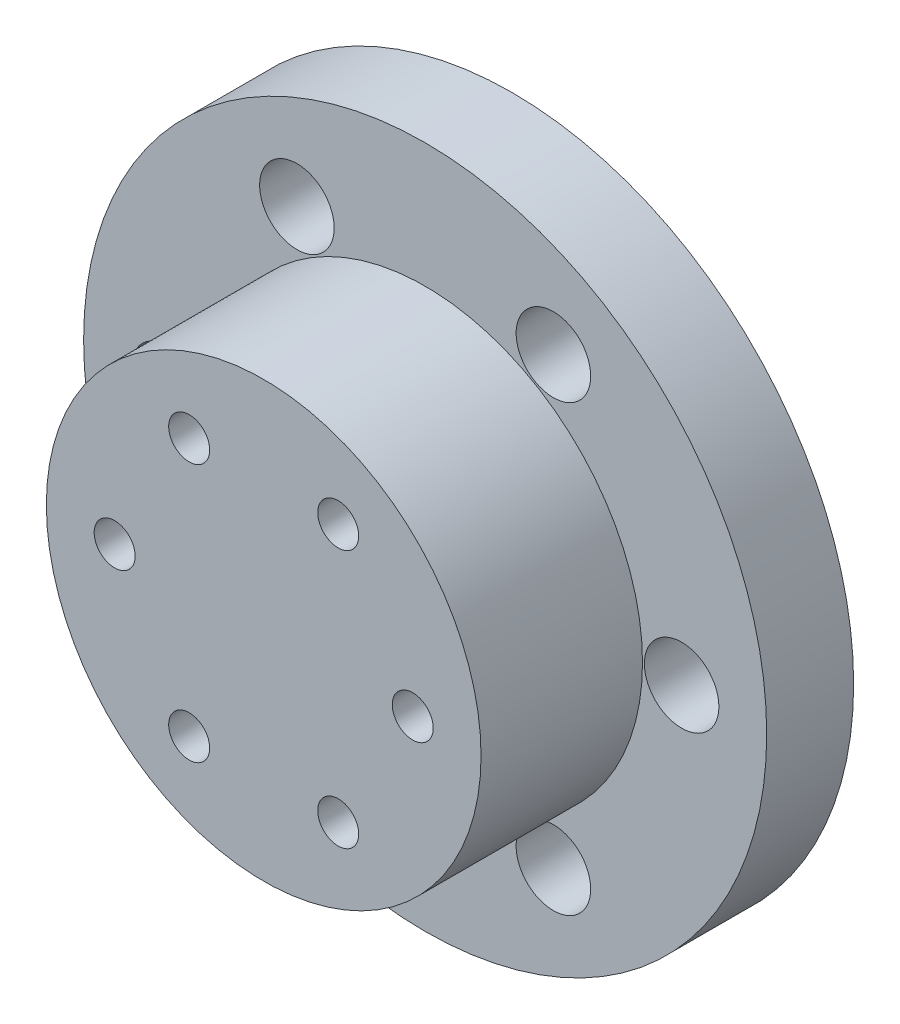
ISO-10303-21;
HEADER;
FILE_DESCRIPTION(('STEP AP214'),'2;1');
FILE_NAME('part.step','',(''),(''),'','','');
FILE_SCHEMA(('AUTOMOTIVE_DESIGN { 1 0 10303 214 1 1 1 1 }'));
ENDSEC;
DATA;
#1=APPLICATION_CONTEXT('core data for automotive mechanical design processes');
#2=APPLICATION_PROTOCOL_DEFINITION('international standard','automotive_design',2000,#1);
#3=PRODUCT_CONTEXT('',#1,'mechanical');
#4=PRODUCT('Part','Part','',(#3));
#5=PRODUCT_RELATED_PRODUCT_CATEGORY('part','',(#4));
#6=PRODUCT_DEFINITION_FORMATION('','',#4);
#7=PRODUCT_DEFINITION_CONTEXT('part definition',#1,'design');
#8=PRODUCT_DEFINITION('design','',#6,#7);
#9=PRODUCT_DEFINITION_SHAPE('','',#8);
#10=(LENGTH_UNIT() NAMED_UNIT(*) SI_UNIT(.MILLI.,.METRE.));
#11=(NAMED_UNIT(*) PLANE_ANGLE_UNIT() SI_UNIT($,.RADIAN.));
#12=(NAMED_UNIT(*) SI_UNIT($,.STERADIAN.) SOLID_ANGLE_UNIT());
#13=UNCERTAINTY_MEASURE_WITH_UNIT(LENGTH_MEASURE(1.E-05),#10,'distance_accuracy_value','');
#14=(GEOMETRIC_REPRESENTATION_CONTEXT(3) GLOBAL_UNCERTAINTY_ASSIGNED_CONTEXT((#13)) GLOBAL_UNIT_ASSIGNED_CONTEXT((#10,
#11,#12)) REPRESENTATION_CONTEXT('',''));
#15=CARTESIAN_POINT('',(0.,0.,0.));
#16=DIRECTION('',(0.,0.,1.));
#17=DIRECTION('',(1.,0.,0.));
#18=AXIS2_PLACEMENT_3D('',#15,#16,#17);
#19=CARTESIAN_POINT('',(0.,0.,7.));
#20=DIRECTION('',(0.,0.,1.));
#21=DIRECTION('',(1.,0.,0.));
#22=AXIS2_PLACEMENT_3D('',#19,#20,#21);
#23=PLANE('',#22);
#24=CARTESIAN_POINT('',(0.,0.,7.));
#25=DIRECTION('',(0.,0.,1.));
#26=DIRECTION('',(1.,0.,0.));
#27=AXIS2_PLACEMENT_3D('',#24,#25,#26);
#28=CIRCLE('',#27,17.5);
#29=CARTESIAN_POINT('',(-17.5,0.,7.));
#30=VERTEX_POINT('',#29);
#31=EDGE_CURVE('E112',#30,#30,#28,.T.);
#32=ORIENTED_EDGE('',*,*,#31,.F.);
#33=EDGE_LOOP('',(#32));
#34=FACE_BOUND('',#33,.T.);
#35=CARTESIAN_POINT('',(-10.325,17.8834245881487,7.));
#36=DIRECTION('',(0.,0.,1.));
#37=DIRECTION('',(1.,0.,0.));
#38=AXIS2_PLACEMENT_3D('',#35,#36,#37);
#39=CIRCLE('',#38,3.);
#40=CARTESIAN_POINT('',(-7.32500000000001,17.8834245881487,7.));
#41=VERTEX_POINT('',#40);
#42=EDGE_CURVE('E133',#41,#41,#39,.T.);
#43=ORIENTED_EDGE('',*,*,#42,.F.);
#44=EDGE_LOOP('',(#43));
#45=FACE_BOUND('',#44,.T.);
#46=CARTESIAN_POINT('',(-10.325,-17.8834245881487,7.));
#47=DIRECTION('',(0.,0.,1.));
#48=DIRECTION('',(1.,0.,0.));
#49=AXIS2_PLACEMENT_3D('',#46,#47,#48);
#50=CIRCLE('',#49,3.);
#51=CARTESIAN_POINT('',(-7.325,-17.8834245881487,7.));
#52=VERTEX_POINT('',#51);
#53=EDGE_CURVE('E145',#52,#52,#50,.T.);
#54=ORIENTED_EDGE('',*,*,#53,.F.);
#55=EDGE_LOOP('',(#54));
#56=FACE_BOUND('',#55,.T.);
#57=CARTESIAN_POINT('',(20.65,0.,7.));
#58=DIRECTION('',(0.,0.,1.));
#59=DIRECTION('',(1.,0.,0.));
#60=AXIS2_PLACEMENT_3D('',#57,#58,#59);
#61=CIRCLE('',#60,3.);
#62=CARTESIAN_POINT('',(23.65,0.,7.));
#63=VERTEX_POINT('',#62);
#64=EDGE_CURVE('E157',#63,#63,#61,.T.);
#65=ORIENTED_EDGE('',*,*,#64,.F.);
#66=EDGE_LOOP('',(#65));
#67=FACE_BOUND('',#66,.T.);
#68=CARTESIAN_POINT('',(0.,0.,7.));
#69=DIRECTION('',(0.,0.,1.));
#70=DIRECTION('',(1.,0.,0.));
#71=AXIS2_PLACEMENT_3D('',#68,#69,#70);
#72=CIRCLE('',#71,27.5);
#73=CARTESIAN_POINT('',(27.5,0.,7.));
#74=VERTEX_POINT('',#73);
#75=EDGE_CURVE('E11',#74,#74,#72,.T.);
#76=ORIENTED_EDGE('',*,*,#75,.T.);
#77=EDGE_LOOP('',(#76));
#78=FACE_BOUND('',#77,.T.);
#79=CARTESIAN_POINT('',(10.325,-17.8834245881487,7.));
#80=DIRECTION('',(0.,0.,1.));
#81=DIRECTION('',(1.,0.,0.));
#82=AXIS2_PLACEMENT_3D('',#79,#80,#81);
#83=CIRCLE('',#82,3.);
#84=CARTESIAN_POINT('',(13.325,-17.8834245881487,7.));
#85=VERTEX_POINT('',#84);
#86=EDGE_CURVE('E151',#85,#85,#83,.T.);
#87=ORIENTED_EDGE('',*,*,#86,.F.);
#88=EDGE_LOOP('',(#87));
#89=FACE_BOUND('',#88,.T.);
#90=CARTESIAN_POINT('',(-20.65,0.,7.));
#91=DIRECTION('',(0.,0.,1.));
#92=DIRECTION('',(1.,0.,0.));
#93=AXIS2_PLACEMENT_3D('',#90,#91,#92);
#94=CIRCLE('',#93,3.);
#95=CARTESIAN_POINT('',(-17.65,0.,7.));
#96=VERTEX_POINT('',#95);
#97=EDGE_CURVE('E139',#96,#96,#94,.T.);
#98=ORIENTED_EDGE('',*,*,#97,.F.);
#99=EDGE_LOOP('',(#98));
#100=FACE_BOUND('',#99,.T.);
#101=CARTESIAN_POINT('',(10.325,17.8834245881487,7.));
#102=DIRECTION('',(0.,0.,1.));
#103=DIRECTION('',(1.,0.,0.));
#104=AXIS2_PLACEMENT_3D('',#101,#102,#103);
#105=CIRCLE('',#104,3.);
#106=CARTESIAN_POINT('',(13.325,17.8834245881487,7.));
#107=VERTEX_POINT('',#106);
#108=EDGE_CURVE('E127',#107,#107,#105,.T.);
#109=ORIENTED_EDGE('',*,*,#108,.F.);
#110=EDGE_LOOP('',(#109));
#111=FACE_BOUND('',#110,.T.);
#112=ADVANCED_FACE('F36',(#34,#45,#56,#67,#78,#89,#100,#111),#23,.T.);
#113=CARTESIAN_POINT('',(0.,0.,0.));
#114=DIRECTION('',(0.,0.,1.));
#115=DIRECTION('',(1.,0.,0.));
#116=AXIS2_PLACEMENT_3D('',#113,#114,#115);
#117=PLANE('',#116);
#118=CARTESIAN_POINT('',(0.,0.,0.));
#119=DIRECTION('',(0.,0.,-1.));
#120=DIRECTION('',(-1.,0.,0.));
#121=AXIS2_PLACEMENT_3D('',#118,#119,#120);
#122=CIRCLE('',#121,10.5);
#123=CARTESIAN_POINT('',(-10.5,0.,0.));
#124=VERTEX_POINT('',#123);
#125=EDGE_CURVE('E118',#124,#124,#122,.T.);
#126=ORIENTED_EDGE('',*,*,#125,.F.);
#127=EDGE_LOOP('',(#126));
#128=FACE_BOUND('',#127,.T.);
#129=CARTESIAN_POINT('',(0.,0.,0.));
#130=DIRECTION('',(0.,0.,1.));
#131=DIRECTION('',(1.,0.,0.));
#132=AXIS2_PLACEMENT_3D('',#129,#130,#131);
#133=CIRCLE('',#132,27.5);
#134=CARTESIAN_POINT('',(27.5,0.,0.));
#135=VERTEX_POINT('',#134);
#136=EDGE_CURVE('E40',#135,#135,#133,.T.);
#137=ORIENTED_EDGE('',*,*,#136,.F.);
#138=EDGE_LOOP('',(#137));
#139=FACE_BOUND('',#138,.T.);
#140=CARTESIAN_POINT('',(20.65,0.,0.));
#141=DIRECTION('',(0.,0.,1.));
#142=DIRECTION('',(1.,0.,0.));
#143=AXIS2_PLACEMENT_3D('',#140,#141,#142);
#144=CIRCLE('',#143,3.);
#145=CARTESIAN_POINT('',(23.65,0.,0.));
#146=VERTEX_POINT('',#145);
#147=EDGE_CURVE('E154',#146,#146,#144,.T.);
#148=ORIENTED_EDGE('',*,*,#147,.T.);
#149=EDGE_LOOP('',(#148));
#150=FACE_BOUND('',#149,.T.);
#151=CARTESIAN_POINT('',(10.325,-17.8834245881487,0.));
#152=DIRECTION('',(0.,0.,1.));
#153=DIRECTION('',(1.,0.,0.));
#154=AXIS2_PLACEMENT_3D('',#151,#152,#153);
#155=CIRCLE('',#154,3.);
#156=CARTESIAN_POINT('',(13.325,-17.8834245881487,0.));
#157=VERTEX_POINT('',#156);
#158=EDGE_CURVE('E148',#157,#157,#155,.T.);
#159=ORIENTED_EDGE('',*,*,#158,.T.);
#160=EDGE_LOOP('',(#159));
#161=FACE_BOUND('',#160,.T.);
#162=CARTESIAN_POINT('',(-10.325,-17.8834245881487,0.));
#163=DIRECTION('',(0.,0.,1.));
#164=DIRECTION('',(1.,0.,0.));
#165=AXIS2_PLACEMENT_3D('',#162,#163,#164);
#166=CIRCLE('',#165,3.);
#167=CARTESIAN_POINT('',(-7.325,-17.8834245881487,0.));
#168=VERTEX_POINT('',#167);
#169=EDGE_CURVE('E142',#168,#168,#166,.T.);
#170=ORIENTED_EDGE('',*,*,#169,.T.);
#171=EDGE_LOOP('',(#170));
#172=FACE_BOUND('',#171,.T.);
#173=CARTESIAN_POINT('',(-20.65,0.,0.));
#174=DIRECTION('',(0.,0.,1.));
#175=DIRECTION('',(1.,0.,0.));
#176=AXIS2_PLACEMENT_3D('',#173,#174,#175);
#177=CIRCLE('',#176,3.);
#178=CARTESIAN_POINT('',(-17.65,0.,0.));
#179=VERTEX_POINT('',#178);
#180=EDGE_CURVE('E136',#179,#179,#177,.T.);
#181=ORIENTED_EDGE('',*,*,#180,.T.);
#182=EDGE_LOOP('',(#181));
#183=FACE_BOUND('',#182,.T.);
#184=CARTESIAN_POINT('',(-10.325,17.8834245881487,0.));
#185=DIRECTION('',(0.,0.,1.));
#186=DIRECTION('',(1.,0.,0.));
#187=AXIS2_PLACEMENT_3D('',#184,#185,#186);
#188=CIRCLE('',#187,3.);
#189=CARTESIAN_POINT('',(-7.32500000000001,17.8834245881487,0.));
#190=VERTEX_POINT('',#189);
#191=EDGE_CURVE('E130',#190,#190,#188,.T.);
#192=ORIENTED_EDGE('',*,*,#191,.T.);
#193=EDGE_LOOP('',(#192));
#194=FACE_BOUND('',#193,.T.);
#195=CARTESIAN_POINT('',(10.325,17.8834245881487,0.));
#196=DIRECTION('',(0.,0.,1.));
#197=DIRECTION('',(1.,0.,0.));
#198=AXIS2_PLACEMENT_3D('',#195,#196,#197);
#199=CIRCLE('',#198,3.);
#200=CARTESIAN_POINT('',(13.325,17.8834245881487,0.));
#201=VERTEX_POINT('',#200);
#202=EDGE_CURVE('E124',#201,#201,#199,.T.);
#203=ORIENTED_EDGE('',*,*,#202,.T.);
#204=EDGE_LOOP('',(#203));
#205=FACE_BOUND('',#204,.T.);
#206=ADVANCED_FACE('F163',(#128,#139,#150,#161,#172,#183,#194,#205),#117,.F.);
#207=CARTESIAN_POINT('',(0.,0.,7.));
#208=DIRECTION('',(0.,0.,-1.));
#209=DIRECTION('',(-1.,0.,0.));
#210=AXIS2_PLACEMENT_3D('',#207,#208,#209);
#211=CYLINDRICAL_SURFACE('',#210,27.5);
#212=ORIENTED_EDGE('',*,*,#75,.F.);
#213=EDGE_LOOP('',(#212));
#214=FACE_BOUND('',#213,.T.);
#215=ORIENTED_EDGE('',*,*,#136,.T.);
#216=EDGE_LOOP('',(#215));
#217=FACE_BOUND('',#216,.T.);
#218=ADVANCED_FACE('F38',(#214,#217),#211,.T.);
#219=CARTESIAN_POINT('',(20.65,0.,7.));
#220=DIRECTION('',(0.,0.,-1.));
#221=DIRECTION('',(-1.,0.,0.));
#222=AXIS2_PLACEMENT_3D('',#219,#220,#221);
#223=CYLINDRICAL_SURFACE('',#222,3.);
#224=ORIENTED_EDGE('',*,*,#64,.T.);
#225=EDGE_LOOP('',(#224));
#226=FACE_BOUND('',#225,.T.);
#227=ORIENTED_EDGE('',*,*,#147,.F.);
#228=EDGE_LOOP('',(#227));
#229=FACE_BOUND('',#228,.T.);
#230=ADVANCED_FACE('F166',(#226,#229),#223,.F.);
#231=CARTESIAN_POINT('',(10.325,-17.8834245881487,7.));
#232=DIRECTION('',(0.,0.,-1.));
#233=DIRECTION('',(-1.,0.,0.));
#234=AXIS2_PLACEMENT_3D('',#231,#232,#233);
#235=CYLINDRICAL_SURFACE('',#234,3.);
#236=ORIENTED_EDGE('',*,*,#86,.T.);
#237=EDGE_LOOP('',(#236));
#238=FACE_BOUND('',#237,.T.);
#239=ORIENTED_EDGE('',*,*,#158,.F.);
#240=EDGE_LOOP('',(#239));
#241=FACE_BOUND('',#240,.T.);
#242=ADVANCED_FACE('F168',(#238,#241),#235,.F.);
#243=CARTESIAN_POINT('',(-10.325,-17.8834245881487,7.));
#244=DIRECTION('',(0.,0.,-1.));
#245=DIRECTION('',(-1.,0.,0.));
#246=AXIS2_PLACEMENT_3D('',#243,#244,#245);
#247=CYLINDRICAL_SURFACE('',#246,3.);
#248=ORIENTED_EDGE('',*,*,#53,.T.);
#249=EDGE_LOOP('',(#248));
#250=FACE_BOUND('',#249,.T.);
#251=ORIENTED_EDGE('',*,*,#169,.F.);
#252=EDGE_LOOP('',(#251));
#253=FACE_BOUND('',#252,.T.);
#254=ADVANCED_FACE('F175',(#250,#253),#247,.F.);
#255=CARTESIAN_POINT('',(-20.65,0.,7.));
#256=DIRECTION('',(0.,0.,-1.));
#257=DIRECTION('',(-1.,0.,0.));
#258=AXIS2_PLACEMENT_3D('',#255,#256,#257);
#259=CYLINDRICAL_SURFACE('',#258,3.);
#260=ORIENTED_EDGE('',*,*,#97,.T.);
#261=EDGE_LOOP('',(#260));
#262=FACE_BOUND('',#261,.T.);
#263=ORIENTED_EDGE('',*,*,#180,.F.);
#264=EDGE_LOOP('',(#263));
#265=FACE_BOUND('',#264,.T.);
#266=ADVANCED_FACE('F217',(#262,#265),#259,.F.);
#267=CARTESIAN_POINT('',(-10.325,17.8834245881487,7.));
#268=DIRECTION('',(0.,0.,-1.));
#269=DIRECTION('',(-1.,0.,0.));
#270=AXIS2_PLACEMENT_3D('',#267,#268,#269);
#271=CYLINDRICAL_SURFACE('',#270,3.);
#272=ORIENTED_EDGE('',*,*,#42,.T.);
#273=EDGE_LOOP('',(#272));
#274=FACE_BOUND('',#273,.T.);
#275=ORIENTED_EDGE('',*,*,#191,.F.);
#276=EDGE_LOOP('',(#275));
#277=FACE_BOUND('',#276,.T.);
#278=ADVANCED_FACE('F206',(#274,#277),#271,.F.);
#279=CARTESIAN_POINT('',(10.325,17.8834245881487,7.));
#280=DIRECTION('',(0.,0.,-1.));
#281=DIRECTION('',(-1.,0.,0.));
#282=AXIS2_PLACEMENT_3D('',#279,#280,#281);
#283=CYLINDRICAL_SURFACE('',#282,3.);
#284=ORIENTED_EDGE('',*,*,#108,.T.);
#285=EDGE_LOOP('',(#284));
#286=FACE_BOUND('',#285,.T.);
#287=ORIENTED_EDGE('',*,*,#202,.F.);
#288=EDGE_LOOP('',(#287));
#289=FACE_BOUND('',#288,.T.);
#290=ADVANCED_FACE('F202',(#286,#289),#283,.F.);
#291=CARTESIAN_POINT('',(0.,0.,5.));
#292=DIRECTION('',(0.,0.,-1.));
#293=DIRECTION('',(-1.,0.,0.));
#294=AXIS2_PLACEMENT_3D('',#291,#292,#293);
#295=CYLINDRICAL_SURFACE('',#294,10.5);
#296=CARTESIAN_POINT('',(0.,0.,5.));
#297=DIRECTION('',(0.,0.,-1.));
#298=DIRECTION('',(-1.,0.,0.));
#299=AXIS2_PLACEMENT_3D('',#296,#297,#298);
#300=CIRCLE('',#299,10.5);
#301=CARTESIAN_POINT('',(-10.5,0.,5.));
#302=VERTEX_POINT('',#301);
#303=EDGE_CURVE('E121',#302,#302,#300,.T.);
#304=ORIENTED_EDGE('',*,*,#303,.F.);
#305=EDGE_LOOP('',(#304));
#306=FACE_BOUND('',#305,.T.);
#307=ORIENTED_EDGE('',*,*,#125,.T.);
#308=EDGE_LOOP('',(#307));
#309=FACE_BOUND('',#308,.T.);
#310=ADVANCED_FACE('F205',(#306,#309),#295,.F.);
#311=CARTESIAN_POINT('',(0.,0.,5.));
#312=DIRECTION('',(0.,0.,-1.));
#313=DIRECTION('',(-1.,0.,0.));
#314=AXIS2_PLACEMENT_3D('',#311,#312,#313);
#315=PLANE('',#314);
#316=CARTESIAN_POINT('',(0.,0.,5.));
#317=DIRECTION('',(0.,0.,-1.));
#318=DIRECTION('',(-1.,0.,0.));
#319=AXIS2_PLACEMENT_3D('',#316,#317,#318);
#320=CIRCLE('',#319,9.);
#321=CARTESIAN_POINT('',(-9.,0.,5.));
#322=VERTEX_POINT('',#321);
#323=EDGE_CURVE('E108',#322,#322,#320,.T.);
#324=ORIENTED_EDGE('',*,*,#323,.F.);
#325=EDGE_LOOP('',(#324));
#326=FACE_BOUND('',#325,.T.);
#327=ORIENTED_EDGE('',*,*,#303,.T.);
#328=EDGE_LOOP('',(#327));
#329=FACE_BOUND('',#328,.T.);
#330=ADVANCED_FACE('F214',(#326,#329),#315,.T.);
#331=CARTESIAN_POINT('',(0.,0.,20.));
#332=DIRECTION('',(0.,0.,-1.));
#333=DIRECTION('',(-1.,0.,0.));
#334=AXIS2_PLACEMENT_3D('',#331,#332,#333);
#335=CYLINDRICAL_SURFACE('',#334,17.5);
#336=CARTESIAN_POINT('',(0.,0.,20.));
#337=DIRECTION('',(0.,0.,1.));
#338=DIRECTION('',(1.,0.,0.));
#339=AXIS2_PLACEMENT_3D('',#336,#337,#338);
#340=CIRCLE('',#339,17.5);
#341=CARTESIAN_POINT('',(-17.5,0.,20.));
#342=VERTEX_POINT('',#341);
#343=EDGE_CURVE('E115',#342,#342,#340,.T.);
#344=CARTESIAN_POINT('',(-17.5,0.,20.));
#345=CARTESIAN_POINT('',(-17.5,0.,19.8645833333333));
#346=CARTESIAN_POINT('',(-17.5,0.,19.7291666666667));
#347=CARTESIAN_POINT('',(-17.5,0.,19.4583333333333));
#348=CARTESIAN_POINT('',(-17.5,0.,19.3229166666667));
#349=CARTESIAN_POINT('',(-17.5,0.,19.0520833333333));
#350=CARTESIAN_POINT('',(-17.5,0.,18.9166666666667));
#351=CARTESIAN_POINT('',(-17.5,0.,18.6458333333333));
#352=CARTESIAN_POINT('',(-17.5,0.,18.5104166666667));
#353=CARTESIAN_POINT('',(-17.5,0.,18.2395833333333));
#354=CARTESIAN_POINT('',(-17.5,0.,18.1041666666667));
#355=CARTESIAN_POINT('',(-17.5,0.,17.8333333333333));
#356=CARTESIAN_POINT('',(-17.5,0.,17.6979166666667));
#357=CARTESIAN_POINT('',(-17.5,0.,17.4270833333333));
#358=CARTESIAN_POINT('',(-17.5,0.,17.2916666666667));
#359=CARTESIAN_POINT('',(-17.5,0.,17.0208333333333));
#360=CARTESIAN_POINT('',(-17.5,0.,16.8854166666667));
#361=CARTESIAN_POINT('',(-17.5,0.,16.6145833333333));
#362=CARTESIAN_POINT('',(-17.5,0.,16.4791666666667));
#363=CARTESIAN_POINT('',(-17.5,0.,16.2083333333333));
#364=CARTESIAN_POINT('',(-17.5,0.,16.0729166666667));
#365=CARTESIAN_POINT('',(-17.5,0.,15.8020833333333));
#366=CARTESIAN_POINT('',(-17.5,0.,15.6666666666667));
#367=CARTESIAN_POINT('',(-17.5,0.,15.3958333333333));
#368=CARTESIAN_POINT('',(-17.5,0.,15.2604166666667));
#369=CARTESIAN_POINT('',(-17.5,0.,14.9895833333333));
#370=CARTESIAN_POINT('',(-17.5,0.,14.8541666666667));
#371=CARTESIAN_POINT('',(-17.5,0.,14.5833333333333));
#372=CARTESIAN_POINT('',(-17.5,0.,14.4479166666667));
#373=CARTESIAN_POINT('',(-17.5,0.,14.1770833333333));
#374=CARTESIAN_POINT('',(-17.5,0.,14.0416666666667));
#375=CARTESIAN_POINT('',(-17.5,0.,13.7708333333333));
#376=CARTESIAN_POINT('',(-17.5,0.,13.6354166666667));
#377=CARTESIAN_POINT('',(-17.5,0.,13.3645833333333));
#378=CARTESIAN_POINT('',(-17.5,0.,13.2291666666667));
#379=CARTESIAN_POINT('',(-17.5,0.,12.9583333333333));
#380=CARTESIAN_POINT('',(-17.5,0.,12.8229166666667));
#381=CARTESIAN_POINT('',(-17.5,0.,12.5520833333333));
#382=CARTESIAN_POINT('',(-17.5,0.,12.4166666666667));
#383=CARTESIAN_POINT('',(-17.5,0.,12.1458333333333));
#384=CARTESIAN_POINT('',(-17.5,0.,12.0104166666667));
#385=CARTESIAN_POINT('',(-17.5,0.,11.7395833333333));
#386=CARTESIAN_POINT('',(-17.5,0.,11.6041666666667));
#387=CARTESIAN_POINT('',(-17.5,0.,11.3333333333333));
#388=CARTESIAN_POINT('',(-17.5,0.,11.1979166666667));
#389=CARTESIAN_POINT('',(-17.5,0.,10.9270833333333));
#390=CARTESIAN_POINT('',(-17.5,0.,10.7916666666667));
#391=CARTESIAN_POINT('',(-17.5,0.,10.5208333333333));
#392=CARTESIAN_POINT('',(-17.5,0.,10.3854166666667));
#393=CARTESIAN_POINT('',(-17.5,0.,10.1145833333333));
#394=CARTESIAN_POINT('',(-17.5,0.,9.97916666666667));
#395=CARTESIAN_POINT('',(-17.5,0.,9.70833333333333));
#396=CARTESIAN_POINT('',(-17.5,0.,9.57291666666667));
#397=CARTESIAN_POINT('',(-17.5,0.,9.30208333333333));
#398=CARTESIAN_POINT('',(-17.5,0.,9.16666666666667));
#399=CARTESIAN_POINT('',(-17.5,0.,8.89583333333333));
#400=CARTESIAN_POINT('',(-17.5,0.,8.76041666666667));
#401=CARTESIAN_POINT('',(-17.5,0.,8.48958333333333));
#402=CARTESIAN_POINT('',(-17.5,0.,8.35416666666667));
#403=CARTESIAN_POINT('',(-17.5,0.,8.08333333333333));
#404=CARTESIAN_POINT('',(-17.5,0.,7.94791666666667));
#405=CARTESIAN_POINT('',(-17.5,0.,7.67708333333333));
#406=CARTESIAN_POINT('',(-17.5,0.,7.54166666666667));
#407=CARTESIAN_POINT('',(-17.5,0.,7.27083333333333));
#408=CARTESIAN_POINT('',(-17.5,0.,7.13541666666667));
#409=CARTESIAN_POINT('',(-17.5,0.,7.));
#410=B_SPLINE_CURVE_WITH_KNOTS('',3,(#344,#345,#346,#347,#348,#349,#350,#351,#352,#353,#354,
#355,#356,#357,#358,#359,#360,#361,#362,#363,#364,#365,#366,#367,#368,#369,#370,#371,#372,#373,
#374,#375,#376,#377,#378,#379,#380,#381,#382,#383,#384,#385,#386,#387,#388,#389,#390,#391,#392,
#393,#394,#395,#396,#397,#398,#399,#400,#401,#402,#403,#404,#405,#406,#407,#408,#409),
.UNSPECIFIED.,.F.,.F.,(4,2,2,2,2,2,2,2,2,2,2,2,2,2,2,2,2,2,2,2,2,2,2,2,2,2,2,2,2,2,2,2,4),(0.,
0.406249999999997,0.812499999999997,1.21875,1.625,2.03125,2.4375,2.84375,3.25,3.65625,4.0625,
4.46875,4.875,5.28125,5.6875,6.09375,6.5,6.90625,7.3125,7.71875,8.125,8.53124999999999,8.9375,
9.34375,9.75,10.15625,10.5625,10.96875,11.375,11.78125,12.1875,12.59375,13.),.UNSPECIFIED.);
#411=EDGE_CURVE('BSEAM276',#342,#30,#410,.T.);
#412=ORIENTED_EDGE('',*,*,#343,.F.);
#413=ORIENTED_EDGE('',*,*,#31,.T.);
#414=ORIENTED_EDGE('',*,*,#411,.T.);
#415=ORIENTED_EDGE('',*,*,#411,.F.);
#416=EDGE_LOOP('',(#412,#414,#413,#415));
#417=FACE_BOUND('',#416,.T.);
#418=ADVANCED_FACE('F276',(#417),#335,.T.);
#419=CARTESIAN_POINT('',(0.,0.,20.));
#420=DIRECTION('',(0.,0.,1.));
#421=DIRECTION('',(1.,0.,0.));
#422=AXIS2_PLACEMENT_3D('',#419,#420,#421);
#423=PLANE('',#422);
#424=CARTESIAN_POINT('',(-6.00000000000001,10.3923048454133,20.));
#425=DIRECTION('',(0.,0.,1.));
#426=DIRECTION('',(1.,0.,0.));
#427=AXIS2_PLACEMENT_3D('',#424,#425,#426);
#428=CIRCLE('',#427,1.64999999999999);
#429=CARTESIAN_POINT('',(-4.35000000000002,10.3923048454133,20.));
#430=VERTEX_POINT('',#429);
#431=EDGE_CURVE('E74',#430,#430,#428,.T.);
#432=ORIENTED_EDGE('',*,*,#431,.F.);
#433=EDGE_LOOP('',(#432));
#434=FACE_BOUND('',#433,.T.);
#435=CARTESIAN_POINT('',(5.99999999999999,10.3923048454133,20.));
#436=DIRECTION('',(0.,0.,1.));
#437=DIRECTION('',(1.,0.,0.));
#438=AXIS2_PLACEMENT_3D('',#435,#436,#437);
#439=CIRCLE('',#438,1.64999999999999);
#440=CARTESIAN_POINT('',(7.64999999999998,10.3923048454133,20.));
#441=VERTEX_POINT('',#440);
#442=EDGE_CURVE('E73',#441,#441,#439,.T.);
#443=ORIENTED_EDGE('',*,*,#442,.F.);
#444=EDGE_LOOP('',(#443));
#445=FACE_BOUND('',#444,.T.);
#446=CARTESIAN_POINT('',(12.,0.,20.));
#447=DIRECTION('',(0.,0.,1.));
#448=DIRECTION('',(1.,0.,0.));
#449=AXIS2_PLACEMENT_3D('',#446,#447,#448);
#450=CIRCLE('',#449,1.64999999999999);
#451=CARTESIAN_POINT('',(13.65,0.,20.));
#452=VERTEX_POINT('',#451);
#453=EDGE_CURVE('E84',#452,#452,#450,.T.);
#454=ORIENTED_EDGE('',*,*,#453,.F.);
#455=EDGE_LOOP('',(#454));
#456=FACE_BOUND('',#455,.T.);
#457=CARTESIAN_POINT('',(6.,-10.3923048454133,20.));
#458=DIRECTION('',(0.,0.,1.));
#459=DIRECTION('',(1.,0.,0.));
#460=AXIS2_PLACEMENT_3D('',#457,#458,#459);
#461=CIRCLE('',#460,1.64999999999999);
#462=CARTESIAN_POINT('',(7.64999999999999,-10.3923048454133,20.));
#463=VERTEX_POINT('',#462);
#464=EDGE_CURVE('E90',#463,#463,#461,.T.);
#465=ORIENTED_EDGE('',*,*,#464,.F.);
#466=EDGE_LOOP('',(#465));
#467=FACE_BOUND('',#466,.T.);
#468=CARTESIAN_POINT('',(-6.,-10.3923048454133,20.));
#469=DIRECTION('',(0.,0.,1.));
#470=DIRECTION('',(1.,0.,0.));
#471=AXIS2_PLACEMENT_3D('',#468,#469,#470);
#472=CIRCLE('',#471,1.64999999999999);
#473=CARTESIAN_POINT('',(-4.35000000000001,-10.3923048454133,20.));
#474=VERTEX_POINT('',#473);
#475=EDGE_CURVE('E96',#474,#474,#472,.T.);
#476=ORIENTED_EDGE('',*,*,#475,.F.);
#477=EDGE_LOOP('',(#476));
#478=FACE_BOUND('',#477,.T.);
#479=CARTESIAN_POINT('',(-12.,0.,20.));
#480=DIRECTION('',(0.,0.,1.));
#481=DIRECTION('',(1.,0.,0.));
#482=AXIS2_PLACEMENT_3D('',#479,#480,#481);
#483=CIRCLE('',#482,1.64999999999999);
#484=CARTESIAN_POINT('',(-10.35,0.,20.));
#485=VERTEX_POINT('',#484);
#486=EDGE_CURVE('E102',#485,#485,#483,.T.);
#487=ORIENTED_EDGE('',*,*,#486,.F.);
#488=EDGE_LOOP('',(#487));
#489=FACE_BOUND('',#488,.T.);
#490=ORIENTED_EDGE('',*,*,#343,.T.);
#491=EDGE_LOOP('',(#490));
#492=FACE_BOUND('',#491,.T.);
#493=ADVANCED_FACE('F281',(#434,#445,#456,#467,#478,#489,#492),#423,.T.);
#494=CARTESIAN_POINT('',(0.,0.,6.5));
#495=DIRECTION('',(0.,0.,-1.));
#496=DIRECTION('',(-1.,0.,0.));
#497=AXIS2_PLACEMENT_3D('',#494,#495,#496);
#498=CYLINDRICAL_SURFACE('',#497,9.);
#499=CARTESIAN_POINT('',(0.,0.,6.5));
#500=DIRECTION('',(0.,0.,-1.));
#501=DIRECTION('',(-1.,0.,0.));
#502=AXIS2_PLACEMENT_3D('',#499,#500,#501);
#503=CIRCLE('',#502,9.);
#504=CARTESIAN_POINT('',(-9.,0.,6.5));
#505=VERTEX_POINT('',#504);
#506=EDGE_CURVE('E109',#505,#505,#503,.T.);
#507=ORIENTED_EDGE('',*,*,#506,.F.);
#508=EDGE_LOOP('',(#507));
#509=FACE_BOUND('',#508,.T.);
#510=ORIENTED_EDGE('',*,*,#323,.T.);
#511=EDGE_LOOP('',(#510));
#512=FACE_BOUND('',#511,.T.);
#513=ADVANCED_FACE('F295',(#509,#512),#498,.F.);
#514=CARTESIAN_POINT('',(0.,0.,6.5));
#515=DIRECTION('',(0.,0.,-1.));
#516=DIRECTION('',(-1.,0.,0.));
#517=AXIS2_PLACEMENT_3D('',#514,#515,#516);
#518=PLANE('',#517);
#519=ORIENTED_EDGE('',*,*,#506,.T.);
#520=EDGE_LOOP('',(#519));
#521=FACE_BOUND('',#520,.T.);
#522=ADVANCED_FACE('F300',(#521),#518,.T.);
#523=CARTESIAN_POINT('',(-12.,0.,12.));
#524=DIRECTION('',(0.,0.,1.));
#525=DIRECTION('',(1.,0.,0.));
#526=AXIS2_PLACEMENT_3D('',#523,#524,#525);
#527=CONICAL_SURFACE('',#526,1.65,1.02974425867665);
#528=CARTESIAN_POINT('',(-12.,0.,11.0085799786045));
#529=VERTEX_POINT('',#528);
#530=VERTEX_LOOP('',#529);
#531=FACE_BOUND('',#530,.T.);
#532=CARTESIAN_POINT('',(-12.,0.,12.));
#533=DIRECTION('',(0.,0.,1.));
#534=DIRECTION('',(1.,0.,0.));
#535=AXIS2_PLACEMENT_3D('',#532,#533,#534);
#536=CIRCLE('',#535,1.65);
#537=CARTESIAN_POINT('',(-10.35,0.,12.));
#538=VERTEX_POINT('',#537);
#539=EDGE_CURVE('E105',#538,#538,#536,.T.);
#540=ORIENTED_EDGE('',*,*,#539,.T.);
#541=EDGE_LOOP('',(#540));
#542=FACE_BOUND('',#541,.T.);
#543=ADVANCED_FACE('F310',(#531,#542),#527,.F.);
#544=CARTESIAN_POINT('',(-12.,0.,20.));
#545=DIRECTION('',(0.,0.,1.));
#546=DIRECTION('',(1.,0.,0.));
#547=AXIS2_PLACEMENT_3D('',#544,#545,#546);
#548=CYLINDRICAL_SURFACE('',#547,1.64999999999999);
#549=ORIENTED_EDGE('',*,*,#539,.F.);
#550=EDGE_LOOP('',(#549));
#551=FACE_BOUND('',#550,.T.);
#552=ORIENTED_EDGE('',*,*,#486,.T.);
#553=EDGE_LOOP('',(#552));
#554=FACE_BOUND('',#553,.T.);
#555=ADVANCED_FACE('F331',(#551,#554),#548,.F.);
#556=CARTESIAN_POINT('',(-6.,-10.3923048454133,12.));
#557=DIRECTION('',(0.,0.,1.));
#558=DIRECTION('',(1.,0.,0.));
#559=AXIS2_PLACEMENT_3D('',#556,#557,#558);
#560=CONICAL_SURFACE('',#559,1.65,1.02974425867665);
#561=CARTESIAN_POINT('',(-6.,-10.3923048454133,11.0085799786045));
#562=VERTEX_POINT('',#561);
#563=VERTEX_LOOP('',#562);
#564=FACE_BOUND('',#563,.T.);
#565=CARTESIAN_POINT('',(-6.,-10.3923048454133,12.));
#566=DIRECTION('',(0.,0.,1.));
#567=DIRECTION('',(1.,0.,0.));
#568=AXIS2_PLACEMENT_3D('',#565,#566,#567);
#569=CIRCLE('',#568,1.65);
#570=CARTESIAN_POINT('',(-4.35,-10.3923048454133,12.));
#571=VERTEX_POINT('',#570);
#572=EDGE_CURVE('E99',#571,#571,#569,.T.);
#573=ORIENTED_EDGE('',*,*,#572,.T.);
#574=EDGE_LOOP('',(#573));
#575=FACE_BOUND('',#574,.T.);
#576=ADVANCED_FACE('F341',(#564,#575),#560,.F.);
#577=CARTESIAN_POINT('',(-6.,-10.3923048454133,20.));
#578=DIRECTION('',(0.,0.,1.));
#579=DIRECTION('',(1.,0.,0.));
#580=AXIS2_PLACEMENT_3D('',#577,#578,#579);
#581=CYLINDRICAL_SURFACE('',#580,1.64999999999999);
#582=ORIENTED_EDGE('',*,*,#572,.F.);
#583=EDGE_LOOP('',(#582));
#584=FACE_BOUND('',#583,.T.);
#585=ORIENTED_EDGE('',*,*,#475,.T.);
#586=EDGE_LOOP('',(#585));
#587=FACE_BOUND('',#586,.T.);
#588=ADVANCED_FACE('F352',(#584,#587),#581,.F.);
#589=CARTESIAN_POINT('',(6.,-10.3923048454133,12.));
#590=DIRECTION('',(0.,0.,1.));
#591=DIRECTION('',(1.,0.,0.));
#592=AXIS2_PLACEMENT_3D('',#589,#590,#591);
#593=CONICAL_SURFACE('',#592,1.65,1.02974425867665);
#594=CARTESIAN_POINT('',(6.,-10.3923048454133,11.0085799786045));
#595=VERTEX_POINT('',#594);
#596=VERTEX_LOOP('',#595);
#597=FACE_BOUND('',#596,.T.);
#598=CARTESIAN_POINT('',(6.,-10.3923048454133,12.));
#599=DIRECTION('',(0.,0.,1.));
#600=DIRECTION('',(1.,0.,0.));
#601=AXIS2_PLACEMENT_3D('',#598,#599,#600);
#602=CIRCLE('',#601,1.65);
#603=CARTESIAN_POINT('',(7.65,-10.3923048454133,12.));
#604=VERTEX_POINT('',#603);
#605=EDGE_CURVE('E93',#604,#604,#602,.T.);
#606=ORIENTED_EDGE('',*,*,#605,.T.);
#607=EDGE_LOOP('',(#606));
#608=FACE_BOUND('',#607,.T.);
#609=ADVANCED_FACE('F361',(#597,#608),#593,.F.);
#610=CARTESIAN_POINT('',(6.,-10.3923048454133,20.));
#611=DIRECTION('',(0.,0.,1.));
#612=DIRECTION('',(1.,0.,0.));
#613=AXIS2_PLACEMENT_3D('',#610,#611,#612);
#614=CYLINDRICAL_SURFACE('',#613,1.64999999999999);
#615=ORIENTED_EDGE('',*,*,#605,.F.);
#616=EDGE_LOOP('',(#615));
#617=FACE_BOUND('',#616,.T.);
#618=ORIENTED_EDGE('',*,*,#464,.T.);
#619=EDGE_LOOP('',(#618));
#620=FACE_BOUND('',#619,.T.);
#621=ADVANCED_FACE('F372',(#617,#620),#614,.F.);
#622=CARTESIAN_POINT('',(12.,0.,12.));
#623=DIRECTION('',(0.,0.,1.));
#624=DIRECTION('',(1.,0.,0.));
#625=AXIS2_PLACEMENT_3D('',#622,#623,#624);
#626=CONICAL_SURFACE('',#625,1.65,1.02974425867665);
#627=CARTESIAN_POINT('',(12.,0.,11.0085799786045));
#628=VERTEX_POINT('',#627);
#629=VERTEX_LOOP('',#628);
#630=FACE_BOUND('',#629,.T.);
#631=CARTESIAN_POINT('',(12.,0.,12.));
#632=DIRECTION('',(0.,0.,1.));
#633=DIRECTION('',(1.,0.,0.));
#634=AXIS2_PLACEMENT_3D('',#631,#632,#633);
#635=CIRCLE('',#634,1.65);
#636=CARTESIAN_POINT('',(13.65,0.,12.));
#637=VERTEX_POINT('',#636);
#638=EDGE_CURVE('E87',#637,#637,#635,.T.);
#639=ORIENTED_EDGE('',*,*,#638,.T.);
#640=EDGE_LOOP('',(#639));
#641=FACE_BOUND('',#640,.T.);
#642=ADVANCED_FACE('F382',(#630,#641),#626,.F.);
#643=CARTESIAN_POINT('',(12.,0.,20.));
#644=DIRECTION('',(0.,0.,1.));
#645=DIRECTION('',(1.,0.,0.));
#646=AXIS2_PLACEMENT_3D('',#643,#644,#645);
#647=CYLINDRICAL_SURFACE('',#646,1.64999999999999);
#648=ORIENTED_EDGE('',*,*,#638,.F.);
#649=EDGE_LOOP('',(#648));
#650=FACE_BOUND('',#649,.T.);
#651=ORIENTED_EDGE('',*,*,#453,.T.);
#652=EDGE_LOOP('',(#651));
#653=FACE_BOUND('',#652,.T.);
#654=ADVANCED_FACE('F394',(#650,#653),#647,.F.);
#655=CARTESIAN_POINT('',(5.99999999999999,10.3923048454133,12.));
#656=DIRECTION('',(0.,0.,1.));
#657=DIRECTION('',(1.,0.,0.));
#658=AXIS2_PLACEMENT_3D('',#655,#656,#657);
#659=CONICAL_SURFACE('',#658,1.65,1.02974425867665);
#660=CARTESIAN_POINT('',(5.99999999999999,10.3923048454133,11.0085799786045));
#661=VERTEX_POINT('',#660);
#662=VERTEX_LOOP('',#661);
#663=FACE_BOUND('',#662,.T.);
#664=CARTESIAN_POINT('',(5.99999999999999,10.3923048454133,12.));
#665=DIRECTION('',(0.,0.,1.));
#666=DIRECTION('',(1.,0.,0.));
#667=AXIS2_PLACEMENT_3D('',#664,#665,#666);
#668=CIRCLE('',#667,1.65);
#669=CARTESIAN_POINT('',(7.64999999999999,10.3923048454133,12.));
#670=VERTEX_POINT('',#669);
#671=EDGE_CURVE('E77',#670,#670,#668,.T.);
#672=ORIENTED_EDGE('',*,*,#671,.T.);
#673=EDGE_LOOP('',(#672));
#674=FACE_BOUND('',#673,.T.);
#675=ADVANCED_FACE('F404',(#663,#674),#659,.F.);
#676=CARTESIAN_POINT('',(5.99999999999999,10.3923048454133,20.));
#677=DIRECTION('',(0.,0.,1.));
#678=DIRECTION('',(1.,0.,0.));
#679=AXIS2_PLACEMENT_3D('',#676,#677,#678);
#680=CYLINDRICAL_SURFACE('',#679,1.64999999999999);
#681=ORIENTED_EDGE('',*,*,#671,.F.);
#682=EDGE_LOOP('',(#681));
#683=FACE_BOUND('',#682,.T.);
#684=ORIENTED_EDGE('',*,*,#442,.T.);
#685=EDGE_LOOP('',(#684));
#686=FACE_BOUND('',#685,.T.);
#687=ADVANCED_FACE('F67',(#683,#686),#680,.F.);
#688=CARTESIAN_POINT('',(-6.00000000000001,10.3923048454133,12.));
#689=DIRECTION('',(0.,0.,1.));
#690=DIRECTION('',(1.,0.,0.));
#691=AXIS2_PLACEMENT_3D('',#688,#689,#690);
#692=CONICAL_SURFACE('',#691,1.65,1.02974425867665);
#693=CARTESIAN_POINT('',(-6.00000000000001,10.3923048454133,11.0085799786045));
#694=VERTEX_POINT('',#693);
#695=VERTEX_LOOP('',#694);
#696=FACE_BOUND('',#695,.T.);
#697=CARTESIAN_POINT('',(-6.00000000000001,10.3923048454133,12.));
#698=DIRECTION('',(0.,0.,1.));
#699=DIRECTION('',(1.,0.,0.));
#700=AXIS2_PLACEMENT_3D('',#697,#698,#699);
#701=CIRCLE('',#700,1.65);
#702=CARTESIAN_POINT('',(-4.35000000000001,10.3923048454133,12.));
#703=VERTEX_POINT('',#702);
#704=EDGE_CURVE('E71',#703,#703,#701,.T.);
#705=ORIENTED_EDGE('',*,*,#704,.T.);
#706=EDGE_LOOP('',(#705));
#707=FACE_BOUND('',#706,.T.);
#708=ADVANCED_FACE('F63',(#696,#707),#692,.F.);
#709=CARTESIAN_POINT('',(-6.00000000000001,10.3923048454133,20.));
#710=DIRECTION('',(0.,0.,1.));
#711=DIRECTION('',(1.,0.,0.));
#712=AXIS2_PLACEMENT_3D('',#709,#710,#711);
#713=CYLINDRICAL_SURFACE('',#712,1.64999999999999);
#714=ORIENTED_EDGE('',*,*,#704,.F.);
#715=EDGE_LOOP('',(#714));
#716=FACE_BOUND('',#715,.T.);
#717=ORIENTED_EDGE('',*,*,#431,.T.);
#718=EDGE_LOOP('',(#717));
#719=FACE_BOUND('',#718,.T.);
#720=ADVANCED_FACE('F66',(#716,#719),#713,.F.);
#721=CLOSED_SHELL('',(#112,#206,#218,#230,#242,#254,#266,#278,#290,#310,#330,#418,#493,#513,
#522,#543,#555,#576,#588,#609,#621,#642,#654,#675,#687,#708,#720));
#722=MANIFOLD_SOLID_BREP('B2',#721);
#723=ADVANCED_BREP_SHAPE_REPRESENTATION('',(#18,#722),#14);
#724=SHAPE_DEFINITION_REPRESENTATION(#9,#723);
ENDSEC;
END-ISO-10303-21;
